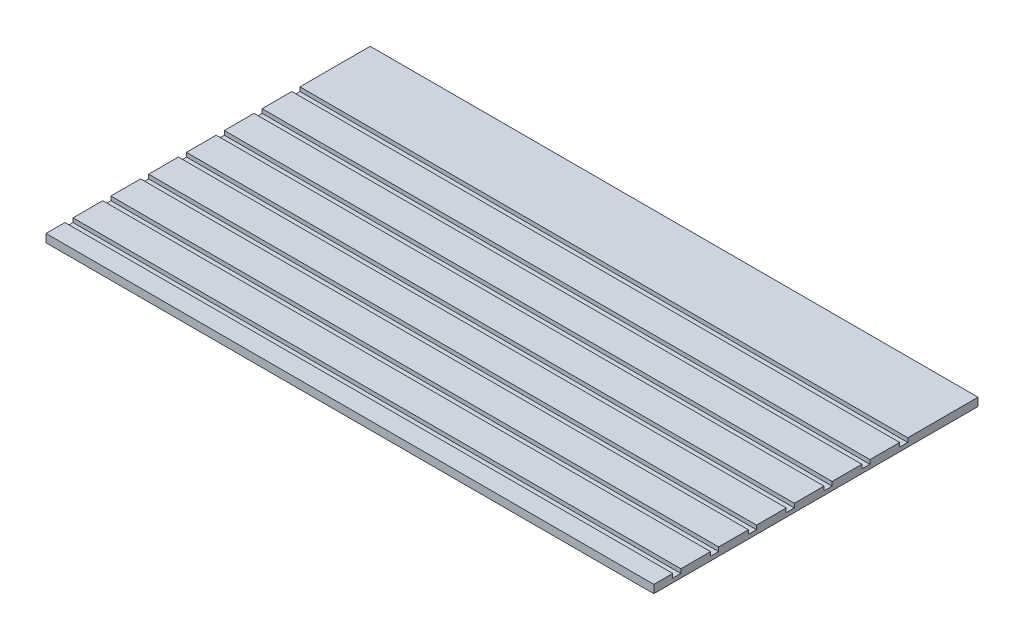
ISO-10303-21;
HEADER;
FILE_DESCRIPTION(('STEP AP214'),'2;1');
FILE_NAME('part.step','',(''),(''),'','','');
FILE_SCHEMA(('AUTOMOTIVE_DESIGN { 1 0 10303 214 1 1 1 1 }'));
ENDSEC;
DATA;
#1=APPLICATION_CONTEXT('core data for automotive mechanical design processes');
#2=APPLICATION_PROTOCOL_DEFINITION('international standard','automotive_design',2000,#1);
#3=PRODUCT_CONTEXT('',#1,'mechanical');
#4=PRODUCT('Part','Part','',(#3));
#5=PRODUCT_RELATED_PRODUCT_CATEGORY('part','',(#4));
#6=PRODUCT_DEFINITION_FORMATION('','',#4);
#7=PRODUCT_DEFINITION_CONTEXT('part definition',#1,'design');
#8=PRODUCT_DEFINITION('design','',#6,#7);
#9=PRODUCT_DEFINITION_SHAPE('','',#8);
#10=(LENGTH_UNIT() NAMED_UNIT(*) SI_UNIT(.MILLI.,.METRE.));
#11=(NAMED_UNIT(*) PLANE_ANGLE_UNIT() SI_UNIT($,.RADIAN.));
#12=(NAMED_UNIT(*) SI_UNIT($,.STERADIAN.) SOLID_ANGLE_UNIT());
#13=UNCERTAINTY_MEASURE_WITH_UNIT(LENGTH_MEASURE(1.E-05),#10,'distance_accuracy_value','');
#14=(GEOMETRIC_REPRESENTATION_CONTEXT(3) GLOBAL_UNCERTAINTY_ASSIGNED_CONTEXT((#13)) GLOBAL_UNIT_ASSIGNED_CONTEXT((#10,
#11,#12)) REPRESENTATION_CONTEXT('',''));
#15=CARTESIAN_POINT('',(0.,0.,0.));
#16=DIRECTION('',(0.,0.,1.));
#17=DIRECTION('',(1.,0.,0.));
#18=AXIS2_PLACEMENT_3D('',#15,#16,#17);
#19=CARTESIAN_POINT('',(0.,19.05,0.));
#20=DIRECTION('',(0.,-1.,0.));
#21=DIRECTION('',(0.,0.,-1.));
#22=AXIS2_PLACEMENT_3D('',#19,#20,#21);
#23=PLANE('',#22);
#24=DIRECTION('',(0.,0.,1.));
#25=VECTOR('',#24,1.);
#26=CARTESIAN_POINT('',(-714.375,19.05,381.));
#27=LINE('',#26,#25);
#28=CARTESIAN_POINT('',(-714.375,19.05,-381.));
#29=VERTEX_POINT('',#28);
#30=CARTESIAN_POINT('',(-714.375,19.05,-215.9));
#31=VERTEX_POINT('',#30);
#32=EDGE_CURVE('E441',#29,#31,#27,.T.);
#33=ORIENTED_EDGE('',*,*,#32,.T.);
#34=DIRECTION('',(-1.,0.,0.));
#35=VECTOR('',#34,1.);
#36=CARTESIAN_POINT('',(714.375,19.05,-215.9));
#37=LINE('',#36,#35);
#38=CARTESIAN_POINT('',(714.375,19.05,-215.9));
#39=VERTEX_POINT('',#38);
#40=EDGE_CURVE('E274',#39,#31,#37,.T.);
#41=ORIENTED_EDGE('',*,*,#40,.F.);
#42=DIRECTION('',(0.,0.,-1.));
#43=VECTOR('',#42,1.);
#44=CARTESIAN_POINT('',(714.375,19.05,381.));
#45=LINE('',#44,#43);
#46=CARTESIAN_POINT('',(714.375,19.05,-381.));
#47=VERTEX_POINT('',#46);
#48=EDGE_CURVE('E265',#39,#47,#45,.T.);
#49=ORIENTED_EDGE('',*,*,#48,.T.);
#50=DIRECTION('',(-1.,0.,0.));
#51=VECTOR('',#50,1.);
#52=CARTESIAN_POINT('',(-714.375,19.05,-381.));
#53=LINE('',#52,#51);
#54=EDGE_CURVE('E451',#47,#29,#53,.T.);
#55=ORIENTED_EDGE('',*,*,#54,.T.);
#56=EDGE_LOOP('',(#33,#41,#49,#55));
#57=FACE_BOUND('',#56,.T.);
#58=ADVANCED_FACE('F36',(#57),#23,.F.);
#59=CARTESIAN_POINT('',(714.375,19.05,-127.));
#60=VERTEX_POINT('',#59);
#61=CARTESIAN_POINT('',(714.375,19.05,-196.85));
#62=VERTEX_POINT('',#61);
#63=EDGE_CURVE('E485',#60,#62,#45,.T.);
#64=ORIENTED_EDGE('',*,*,#63,.T.);
#65=DIRECTION('',(-1.,0.,0.));
#66=VECTOR('',#65,1.);
#67=CARTESIAN_POINT('',(714.375,19.05,-196.85));
#68=LINE('',#67,#66);
#69=CARTESIAN_POINT('',(-714.375,19.05,-196.85));
#70=VERTEX_POINT('',#69);
#71=EDGE_CURVE('E277',#62,#70,#68,.T.);
#72=ORIENTED_EDGE('',*,*,#71,.T.);
#73=CARTESIAN_POINT('',(-714.375,19.05,-127.));
#74=VERTEX_POINT('',#73);
#75=EDGE_CURVE('E445',#70,#74,#27,.T.);
#76=ORIENTED_EDGE('',*,*,#75,.T.);
#77=DIRECTION('',(-1.,0.,0.));
#78=VECTOR('',#77,1.);
#79=CARTESIAN_POINT('',(714.375,19.05,-127.));
#80=LINE('',#79,#78);
#81=EDGE_CURVE('E296',#60,#74,#80,.T.);
#82=ORIENTED_EDGE('',*,*,#81,.F.);
#83=EDGE_LOOP('',(#64,#72,#76,#82));
#84=FACE_BOUND('',#83,.T.);
#85=ADVANCED_FACE('F542',(#84),#23,.F.);
#86=CARTESIAN_POINT('',(714.375,19.05,-38.1));
#87=VERTEX_POINT('',#86);
#88=CARTESIAN_POINT('',(714.375,19.05,-107.95));
#89=VERTEX_POINT('',#88);
#90=EDGE_CURVE('E487',#87,#89,#45,.T.);
#91=ORIENTED_EDGE('',*,*,#90,.T.);
#92=DIRECTION('',(-1.,0.,0.));
#93=VECTOR('',#92,1.);
#94=CARTESIAN_POINT('',(714.375,19.05,-107.95));
#95=LINE('',#94,#93);
#96=CARTESIAN_POINT('',(-714.375,19.05,-107.95));
#97=VERTEX_POINT('',#96);
#98=EDGE_CURVE('E300',#89,#97,#95,.T.);
#99=ORIENTED_EDGE('',*,*,#98,.T.);
#100=CARTESIAN_POINT('',(-714.375,19.05,-38.1));
#101=VERTEX_POINT('',#100);
#102=EDGE_CURVE('E841',#97,#101,#27,.T.);
#103=ORIENTED_EDGE('',*,*,#102,.T.);
#104=DIRECTION('',(-1.,0.,0.));
#105=VECTOR('',#104,1.);
#106=CARTESIAN_POINT('',(714.375,19.05,-38.1));
#107=LINE('',#106,#105);
#108=EDGE_CURVE('E323',#87,#101,#107,.T.);
#109=ORIENTED_EDGE('',*,*,#108,.F.);
#110=EDGE_LOOP('',(#91,#99,#103,#109));
#111=FACE_BOUND('',#110,.T.);
#112=ADVANCED_FACE('F547',(#111),#23,.F.);
#113=CARTESIAN_POINT('',(714.375,19.05,50.8));
#114=VERTEX_POINT('',#113);
#115=CARTESIAN_POINT('',(714.375,19.05,-19.05));
#116=VERTEX_POINT('',#115);
#117=EDGE_CURVE('E492',#114,#116,#45,.T.);
#118=ORIENTED_EDGE('',*,*,#117,.T.);
#119=DIRECTION('',(-1.,0.,0.));
#120=VECTOR('',#119,1.);
#121=CARTESIAN_POINT('',(714.375,19.05,-19.05));
#122=LINE('',#121,#120);
#123=CARTESIAN_POINT('',(-714.375,19.05,-19.05));
#124=VERTEX_POINT('',#123);
#125=EDGE_CURVE('E327',#116,#124,#122,.T.);
#126=ORIENTED_EDGE('',*,*,#125,.T.);
#127=CARTESIAN_POINT('',(-714.375,19.05,50.8));
#128=VERTEX_POINT('',#127);
#129=EDGE_CURVE('E842',#124,#128,#27,.T.);
#130=ORIENTED_EDGE('',*,*,#129,.T.);
#131=DIRECTION('',(-1.,0.,0.));
#132=VECTOR('',#131,1.);
#133=CARTESIAN_POINT('',(714.375,19.05,50.8));
#134=LINE('',#133,#132);
#135=EDGE_CURVE('E350',#114,#128,#134,.T.);
#136=ORIENTED_EDGE('',*,*,#135,.F.);
#137=EDGE_LOOP('',(#118,#126,#130,#136));
#138=FACE_BOUND('',#137,.T.);
#139=ADVANCED_FACE('F566',(#138),#23,.F.);
#140=CARTESIAN_POINT('',(714.375,19.05,139.7));
#141=VERTEX_POINT('',#140);
#142=CARTESIAN_POINT('',(714.375,19.05,69.85));
#143=VERTEX_POINT('',#142);
#144=EDGE_CURVE('E497',#141,#143,#45,.T.);
#145=ORIENTED_EDGE('',*,*,#144,.T.);
#146=DIRECTION('',(-1.,0.,0.));
#147=VECTOR('',#146,1.);
#148=CARTESIAN_POINT('',(714.375,19.05,69.85));
#149=LINE('',#148,#147);
#150=CARTESIAN_POINT('',(-714.375,19.05,69.85));
#151=VERTEX_POINT('',#150);
#152=EDGE_CURVE('E354',#143,#151,#149,.T.);
#153=ORIENTED_EDGE('',*,*,#152,.T.);
#154=CARTESIAN_POINT('',(-714.375,19.05,139.7));
#155=VERTEX_POINT('',#154);
#156=EDGE_CURVE('E529',#151,#155,#27,.T.);
#157=ORIENTED_EDGE('',*,*,#156,.T.);
#158=DIRECTION('',(-1.,0.,0.));
#159=VECTOR('',#158,1.);
#160=CARTESIAN_POINT('',(714.375,19.05,139.7));
#161=LINE('',#160,#159);
#162=EDGE_CURVE('E377',#141,#155,#161,.T.);
#163=ORIENTED_EDGE('',*,*,#162,.F.);
#164=EDGE_LOOP('',(#145,#153,#157,#163));
#165=FACE_BOUND('',#164,.T.);
#166=ADVANCED_FACE('F562',(#165),#23,.F.);
#167=CARTESIAN_POINT('',(714.375,19.05,228.6));
#168=VERTEX_POINT('',#167);
#169=CARTESIAN_POINT('',(714.375,19.05,158.75));
#170=VERTEX_POINT('',#169);
#171=EDGE_CURVE('E502',#168,#170,#45,.T.);
#172=ORIENTED_EDGE('',*,*,#171,.T.);
#173=DIRECTION('',(-1.,0.,0.));
#174=VECTOR('',#173,1.);
#175=CARTESIAN_POINT('',(714.375,19.05,158.75));
#176=LINE('',#175,#174);
#177=CARTESIAN_POINT('',(-714.375,19.05,158.75));
#178=VERTEX_POINT('',#177);
#179=EDGE_CURVE('E381',#170,#178,#176,.T.);
#180=ORIENTED_EDGE('',*,*,#179,.T.);
#181=CARTESIAN_POINT('',(-714.375,19.05,228.6));
#182=VERTEX_POINT('',#181);
#183=EDGE_CURVE('E528',#178,#182,#27,.T.);
#184=ORIENTED_EDGE('',*,*,#183,.T.);
#185=DIRECTION('',(-1.,0.,0.));
#186=VECTOR('',#185,1.);
#187=CARTESIAN_POINT('',(714.375,19.05,228.6));
#188=LINE('',#187,#186);
#189=EDGE_CURVE('E404',#168,#182,#188,.T.);
#190=ORIENTED_EDGE('',*,*,#189,.F.);
#191=EDGE_LOOP('',(#172,#180,#184,#190));
#192=FACE_BOUND('',#191,.T.);
#193=ADVANCED_FACE('F558',(#192),#23,.F.);
#194=CARTESIAN_POINT('',(714.375,19.05,317.5));
#195=VERTEX_POINT('',#194);
#196=CARTESIAN_POINT('',(714.375,19.05,247.65));
#197=VERTEX_POINT('',#196);
#198=EDGE_CURVE('E452',#195,#197,#45,.T.);
#199=ORIENTED_EDGE('',*,*,#198,.T.);
#200=DIRECTION('',(-1.,0.,0.));
#201=VECTOR('',#200,1.);
#202=CARTESIAN_POINT('',(714.375,19.05,247.65));
#203=LINE('',#202,#201);
#204=CARTESIAN_POINT('',(-714.375,19.05,247.65));
#205=VERTEX_POINT('',#204);
#206=EDGE_CURVE('E408',#197,#205,#203,.T.);
#207=ORIENTED_EDGE('',*,*,#206,.T.);
#208=CARTESIAN_POINT('',(-714.375,19.05,317.5));
#209=VERTEX_POINT('',#208);
#210=EDGE_CURVE('E526',#205,#209,#27,.T.);
#211=ORIENTED_EDGE('',*,*,#210,.T.);
#212=DIRECTION('',(-1.,0.,0.));
#213=VECTOR('',#212,1.);
#214=CARTESIAN_POINT('',(714.375,19.05,317.5));
#215=LINE('',#214,#213);
#216=EDGE_CURVE('E431',#195,#209,#215,.T.);
#217=ORIENTED_EDGE('',*,*,#216,.F.);
#218=EDGE_LOOP('',(#199,#207,#211,#217));
#219=FACE_BOUND('',#218,.T.);
#220=ADVANCED_FACE('F514',(#219),#23,.F.);
#221=CARTESIAN_POINT('',(-714.375,19.05,381.));
#222=DIRECTION('',(1.,0.,0.));
#223=DIRECTION('',(0.,0.,-1.));
#224=AXIS2_PLACEMENT_3D('',#221,#222,#223);
#225=PLANE('',#224);
#226=DIRECTION('',(0.,0.,1.));
#227=VECTOR('',#226,1.);
#228=CARTESIAN_POINT('',(-714.375,9.52500000000001,-215.9));
#229=LINE('',#228,#227);
#230=CARTESIAN_POINT('',(-714.375,9.52500000000001,-215.9));
#231=VERTEX_POINT('',#230);
#232=CARTESIAN_POINT('',(-714.375,9.52500000000001,-196.85));
#233=VERTEX_POINT('',#232);
#234=EDGE_CURVE('E268',#231,#233,#229,.T.);
#235=ORIENTED_EDGE('',*,*,#234,.F.);
#236=DIRECTION('',(0.,-1.,0.));
#237=VECTOR('',#236,1.);
#238=CARTESIAN_POINT('',(-714.375,19.05,-215.9));
#239=LINE('',#238,#237);
#240=EDGE_CURVE('E251',#31,#231,#239,.T.);
#241=ORIENTED_EDGE('',*,*,#240,.F.);
#242=ORIENTED_EDGE('',*,*,#32,.F.);
#243=DIRECTION('',(0.,-1.,0.));
#244=VECTOR('',#243,1.);
#245=CARTESIAN_POINT('',(-714.375,19.05,-381.));
#246=LINE('',#245,#244);
#247=CARTESIAN_POINT('',(-714.375,0.,-381.));
#248=VERTEX_POINT('',#247);
#249=EDGE_CURVE('E454',#29,#248,#246,.T.);
#250=ORIENTED_EDGE('',*,*,#249,.T.);
#251=DIRECTION('',(0.,0.,1.));
#252=VECTOR('',#251,1.);
#253=CARTESIAN_POINT('',(-714.375,0.,381.));
#254=LINE('',#253,#252);
#255=CARTESIAN_POINT('',(-714.375,0.,381.));
#256=VERTEX_POINT('',#255);
#257=EDGE_CURVE('E434',#248,#256,#254,.T.);
#258=ORIENTED_EDGE('',*,*,#257,.T.);
#259=DIRECTION('',(0.,-1.,0.));
#260=VECTOR('',#259,1.);
#261=CARTESIAN_POINT('',(-714.375,19.05,381.));
#262=LINE('',#261,#260);
#263=CARTESIAN_POINT('',(-714.375,19.05,381.));
#264=VERTEX_POINT('',#263);
#265=EDGE_CURVE('E11',#264,#256,#262,.T.);
#266=ORIENTED_EDGE('',*,*,#265,.F.);
#267=CARTESIAN_POINT('',(-714.375,19.05,336.55));
#268=VERTEX_POINT('',#267);
#269=EDGE_CURVE('E446',#268,#264,#27,.T.);
#270=ORIENTED_EDGE('',*,*,#269,.F.);
#271=DIRECTION('',(0.,1.,0.));
#272=VECTOR('',#271,1.);
#273=CARTESIAN_POINT('',(-714.375,19.05,336.55));
#274=LINE('',#273,#272);
#275=CARTESIAN_POINT('',(-714.375,9.52500000000001,336.55));
#276=VERTEX_POINT('',#275);
#277=EDGE_CURVE('E418',#276,#268,#274,.T.);
#278=ORIENTED_EDGE('',*,*,#277,.F.);
#279=DIRECTION('',(0.,0.,1.));
#280=VECTOR('',#279,1.);
#281=CARTESIAN_POINT('',(-714.375,9.52500000000001,317.5));
#282=LINE('',#281,#280);
#283=CARTESIAN_POINT('',(-714.375,9.52500000000001,317.5));
#284=VERTEX_POINT('',#283);
#285=EDGE_CURVE('E427',#284,#276,#282,.T.);
#286=ORIENTED_EDGE('',*,*,#285,.F.);
#287=DIRECTION('',(0.,-1.,0.));
#288=VECTOR('',#287,1.);
#289=CARTESIAN_POINT('',(-714.375,19.05,317.5));
#290=LINE('',#289,#288);
#291=EDGE_CURVE('E407',#209,#284,#290,.T.);
#292=ORIENTED_EDGE('',*,*,#291,.F.);
#293=ORIENTED_EDGE('',*,*,#210,.F.);
#294=DIRECTION('',(0.,1.,0.));
#295=VECTOR('',#294,1.);
#296=CARTESIAN_POINT('',(-714.375,19.05,247.65));
#297=LINE('',#296,#295);
#298=CARTESIAN_POINT('',(-714.375,9.52500000000001,247.65));
#299=VERTEX_POINT('',#298);
#300=EDGE_CURVE('E391',#299,#205,#297,.T.);
#301=ORIENTED_EDGE('',*,*,#300,.F.);
#302=DIRECTION('',(0.,0.,1.));
#303=VECTOR('',#302,1.);
#304=CARTESIAN_POINT('',(-714.375,9.52500000000001,228.6));
#305=LINE('',#304,#303);
#306=CARTESIAN_POINT('',(-714.375,9.52500000000001,228.6));
#307=VERTEX_POINT('',#306);
#308=EDGE_CURVE('E400',#307,#299,#305,.T.);
#309=ORIENTED_EDGE('',*,*,#308,.F.);
#310=DIRECTION('',(0.,-1.,0.));
#311=VECTOR('',#310,1.);
#312=CARTESIAN_POINT('',(-714.375,19.05,228.6));
#313=LINE('',#312,#311);
#314=EDGE_CURVE('E380',#182,#307,#313,.T.);
#315=ORIENTED_EDGE('',*,*,#314,.F.);
#316=ORIENTED_EDGE('',*,*,#183,.F.);
#317=DIRECTION('',(0.,1.,0.));
#318=VECTOR('',#317,1.);
#319=CARTESIAN_POINT('',(-714.375,19.05,158.75));
#320=LINE('',#319,#318);
#321=CARTESIAN_POINT('',(-714.375,9.52500000000001,158.75));
#322=VERTEX_POINT('',#321);
#323=EDGE_CURVE('E364',#322,#178,#320,.T.);
#324=ORIENTED_EDGE('',*,*,#323,.F.);
#325=DIRECTION('',(0.,0.,1.));
#326=VECTOR('',#325,1.);
#327=CARTESIAN_POINT('',(-714.375,9.52500000000001,139.7));
#328=LINE('',#327,#326);
#329=CARTESIAN_POINT('',(-714.375,9.52500000000001,139.7));
#330=VERTEX_POINT('',#329);
#331=EDGE_CURVE('E373',#330,#322,#328,.T.);
#332=ORIENTED_EDGE('',*,*,#331,.F.);
#333=DIRECTION('',(0.,-1.,0.));
#334=VECTOR('',#333,1.);
#335=CARTESIAN_POINT('',(-714.375,19.05,139.7));
#336=LINE('',#335,#334);
#337=EDGE_CURVE('E353',#155,#330,#336,.T.);
#338=ORIENTED_EDGE('',*,*,#337,.F.);
#339=ORIENTED_EDGE('',*,*,#156,.F.);
#340=DIRECTION('',(0.,1.,0.));
#341=VECTOR('',#340,1.);
#342=CARTESIAN_POINT('',(-714.375,19.05,69.85));
#343=LINE('',#342,#341);
#344=CARTESIAN_POINT('',(-714.375,9.52500000000001,69.85));
#345=VERTEX_POINT('',#344);
#346=EDGE_CURVE('E337',#345,#151,#343,.T.);
#347=ORIENTED_EDGE('',*,*,#346,.F.);
#348=DIRECTION('',(0.,0.,1.));
#349=VECTOR('',#348,1.);
#350=CARTESIAN_POINT('',(-714.375,9.52500000000001,50.8));
#351=LINE('',#350,#349);
#352=CARTESIAN_POINT('',(-714.375,9.52500000000001,50.8));
#353=VERTEX_POINT('',#352);
#354=EDGE_CURVE('E346',#353,#345,#351,.T.);
#355=ORIENTED_EDGE('',*,*,#354,.F.);
#356=DIRECTION('',(0.,-1.,0.));
#357=VECTOR('',#356,1.);
#358=CARTESIAN_POINT('',(-714.375,19.05,50.8));
#359=LINE('',#358,#357);
#360=EDGE_CURVE('E326',#128,#353,#359,.T.);
#361=ORIENTED_EDGE('',*,*,#360,.F.);
#362=ORIENTED_EDGE('',*,*,#129,.F.);
#363=DIRECTION('',(0.,1.,0.));
#364=VECTOR('',#363,1.);
#365=CARTESIAN_POINT('',(-714.375,19.05,-19.05));
#366=LINE('',#365,#364);
#367=CARTESIAN_POINT('',(-714.375,9.52500000000001,-19.05));
#368=VERTEX_POINT('',#367);
#369=EDGE_CURVE('E310',#368,#124,#366,.T.);
#370=ORIENTED_EDGE('',*,*,#369,.F.);
#371=DIRECTION('',(0.,0.,1.));
#372=VECTOR('',#371,1.);
#373=CARTESIAN_POINT('',(-714.375,9.52500000000001,-38.1));
#374=LINE('',#373,#372);
#375=CARTESIAN_POINT('',(-714.375,9.52500000000001,-38.1));
#376=VERTEX_POINT('',#375);
#377=EDGE_CURVE('E319',#376,#368,#374,.T.);
#378=ORIENTED_EDGE('',*,*,#377,.F.);
#379=DIRECTION('',(0.,-1.,0.));
#380=VECTOR('',#379,1.);
#381=CARTESIAN_POINT('',(-714.375,19.05,-38.1));
#382=LINE('',#381,#380);
#383=EDGE_CURVE('E299',#101,#376,#382,.T.);
#384=ORIENTED_EDGE('',*,*,#383,.F.);
#385=ORIENTED_EDGE('',*,*,#102,.F.);
#386=DIRECTION('',(0.,1.,0.));
#387=VECTOR('',#386,1.);
#388=CARTESIAN_POINT('',(-714.375,19.05,-107.95));
#389=LINE('',#388,#387);
#390=CARTESIAN_POINT('',(-714.375,9.52500000000001,-107.95));
#391=VERTEX_POINT('',#390);
#392=EDGE_CURVE('E285',#391,#97,#389,.T.);
#393=ORIENTED_EDGE('',*,*,#392,.F.);
#394=DIRECTION('',(0.,0.,1.));
#395=VECTOR('',#394,1.);
#396=CARTESIAN_POINT('',(-714.375,9.52500000000001,-127.));
#397=LINE('',#396,#395);
#398=CARTESIAN_POINT('',(-714.375,9.52500000000001,-127.));
#399=VERTEX_POINT('',#398);
#400=EDGE_CURVE('E292',#399,#391,#397,.T.);
#401=ORIENTED_EDGE('',*,*,#400,.F.);
#402=DIRECTION('',(0.,-1.,0.));
#403=VECTOR('',#402,1.);
#404=CARTESIAN_POINT('',(-714.375,19.05,-127.));
#405=LINE('',#404,#403);
#406=EDGE_CURVE('E276',#74,#399,#405,.T.);
#407=ORIENTED_EDGE('',*,*,#406,.F.);
#408=ORIENTED_EDGE('',*,*,#75,.F.);
#409=DIRECTION('',(0.,1.,0.));
#410=VECTOR('',#409,1.);
#411=CARTESIAN_POINT('',(-714.375,19.05,-196.85));
#412=LINE('',#411,#410);
#413=EDGE_CURVE('E266',#233,#70,#412,.T.);
#414=ORIENTED_EDGE('',*,*,#413,.F.);
#415=EDGE_LOOP('',(#235,#241,#242,#250,#258,#266,#270,#278,#286,#292,#293,#301,#309,#315,#316,
#324,#332,#338,#339,#347,#355,#361,#362,#370,#378,#384,#385,#393,#401,#407,#408,#414));
#416=FACE_BOUND('',#415,.T.);
#417=ADVANCED_FACE('F38',(#416),#225,.F.);
#418=CARTESIAN_POINT('',(-714.375,19.05,381.));
#419=DIRECTION('',(0.,0.,-1.));
#420=DIRECTION('',(-1.,0.,0.));
#421=AXIS2_PLACEMENT_3D('',#418,#419,#420);
#422=PLANE('',#421);
#423=DIRECTION('',(1.,0.,0.));
#424=VECTOR('',#423,1.);
#425=CARTESIAN_POINT('',(-714.375,0.,381.));
#426=LINE('',#425,#424);
#427=CARTESIAN_POINT('',(714.375,0.,381.));
#428=VERTEX_POINT('',#427);
#429=EDGE_CURVE('E457',#256,#428,#426,.T.);
#430=ORIENTED_EDGE('',*,*,#429,.T.);
#431=DIRECTION('',(0.,-1.,0.));
#432=VECTOR('',#431,1.);
#433=CARTESIAN_POINT('',(714.375,19.05,381.));
#434=LINE('',#433,#432);
#435=CARTESIAN_POINT('',(714.375,19.05,381.));
#436=VERTEX_POINT('',#435);
#437=EDGE_CURVE('E44',#436,#428,#434,.T.);
#438=ORIENTED_EDGE('',*,*,#437,.F.);
#439=DIRECTION('',(1.,0.,0.));
#440=VECTOR('',#439,1.);
#441=CARTESIAN_POINT('',(-714.375,19.05,381.));
#442=LINE('',#441,#440);
#443=EDGE_CURVE('E444',#264,#436,#442,.T.);
#444=ORIENTED_EDGE('',*,*,#443,.F.);
#445=ORIENTED_EDGE('',*,*,#265,.T.);
#446=EDGE_LOOP('',(#430,#438,#444,#445));
#447=FACE_BOUND('',#446,.T.);
#448=ADVANCED_FACE('F534',(#447),#422,.F.);
#449=CARTESIAN_POINT('',(714.375,19.05,381.));
#450=DIRECTION('',(-1.,0.,0.));
#451=DIRECTION('',(0.,0.,1.));
#452=AXIS2_PLACEMENT_3D('',#449,#450,#451);
#453=PLANE('',#452);
#454=ORIENTED_EDGE('',*,*,#48,.F.);
#455=DIRECTION('',(0.,-1.,0.));
#456=VECTOR('',#455,1.);
#457=CARTESIAN_POINT('',(714.375,19.05,-215.9));
#458=LINE('',#457,#456);
#459=CARTESIAN_POINT('',(714.375,9.52500000000001,-215.9));
#460=VERTEX_POINT('',#459);
#461=EDGE_CURVE('E248',#39,#460,#458,.T.);
#462=ORIENTED_EDGE('',*,*,#461,.T.);
#463=DIRECTION('',(0.,0.,1.));
#464=VECTOR('',#463,1.);
#465=CARTESIAN_POINT('',(714.375,9.52500000000001,-215.9));
#466=LINE('',#465,#464);
#467=CARTESIAN_POINT('',(714.375,9.52500000000001,-196.85));
#468=VERTEX_POINT('',#467);
#469=EDGE_CURVE('E258',#460,#468,#466,.T.);
#470=ORIENTED_EDGE('',*,*,#469,.T.);
#471=DIRECTION('',(0.,1.,0.));
#472=VECTOR('',#471,1.);
#473=CARTESIAN_POINT('',(714.375,19.05,-196.85));
#474=LINE('',#473,#472);
#475=EDGE_CURVE('E51',#468,#62,#474,.T.);
#476=ORIENTED_EDGE('',*,*,#475,.T.);
#477=ORIENTED_EDGE('',*,*,#63,.F.);
#478=DIRECTION('',(0.,-1.,0.));
#479=VECTOR('',#478,1.);
#480=CARTESIAN_POINT('',(714.375,19.05,-127.));
#481=LINE('',#480,#479);
#482=CARTESIAN_POINT('',(714.375,9.52500000000001,-127.));
#483=VERTEX_POINT('',#482);
#484=EDGE_CURVE('E281',#60,#483,#481,.T.);
#485=ORIENTED_EDGE('',*,*,#484,.T.);
#486=DIRECTION('',(0.,0.,1.));
#487=VECTOR('',#486,1.);
#488=CARTESIAN_POINT('',(714.375,9.52500000000001,-127.));
#489=LINE('',#488,#487);
#490=CARTESIAN_POINT('',(714.375,9.52500000000001,-107.95));
#491=VERTEX_POINT('',#490);
#492=EDGE_CURVE('E284',#483,#491,#489,.T.);
#493=ORIENTED_EDGE('',*,*,#492,.T.);
#494=DIRECTION('',(0.,1.,0.));
#495=VECTOR('',#494,1.);
#496=CARTESIAN_POINT('',(714.375,19.05,-107.95));
#497=LINE('',#496,#495);
#498=EDGE_CURVE('E59',#491,#89,#497,.T.);
#499=ORIENTED_EDGE('',*,*,#498,.T.);
#500=ORIENTED_EDGE('',*,*,#90,.F.);
#501=DIRECTION('',(0.,-1.,0.));
#502=VECTOR('',#501,1.);
#503=CARTESIAN_POINT('',(714.375,19.05,-38.1));
#504=LINE('',#503,#502);
#505=CARTESIAN_POINT('',(714.375,9.52500000000001,-38.1));
#506=VERTEX_POINT('',#505);
#507=EDGE_CURVE('E306',#87,#506,#504,.T.);
#508=ORIENTED_EDGE('',*,*,#507,.T.);
#509=DIRECTION('',(0.,0.,1.));
#510=VECTOR('',#509,1.);
#511=CARTESIAN_POINT('',(714.375,9.52500000000001,-38.1));
#512=LINE('',#511,#510);
#513=CARTESIAN_POINT('',(714.375,9.52500000000001,-19.05));
#514=VERTEX_POINT('',#513);
#515=EDGE_CURVE('E309',#506,#514,#512,.T.);
#516=ORIENTED_EDGE('',*,*,#515,.T.);
#517=DIRECTION('',(0.,1.,0.));
#518=VECTOR('',#517,1.);
#519=CARTESIAN_POINT('',(714.375,19.05,-19.05));
#520=LINE('',#519,#518);
#521=EDGE_CURVE('E313',#514,#116,#520,.T.);
#522=ORIENTED_EDGE('',*,*,#521,.T.);
#523=ORIENTED_EDGE('',*,*,#117,.F.);
#524=DIRECTION('',(0.,-1.,0.));
#525=VECTOR('',#524,1.);
#526=CARTESIAN_POINT('',(714.375,19.05,50.8));
#527=LINE('',#526,#525);
#528=CARTESIAN_POINT('',(714.375,9.52500000000001,50.8));
#529=VERTEX_POINT('',#528);
#530=EDGE_CURVE('E333',#114,#529,#527,.T.);
#531=ORIENTED_EDGE('',*,*,#530,.T.);
#532=DIRECTION('',(0.,0.,1.));
#533=VECTOR('',#532,1.);
#534=CARTESIAN_POINT('',(714.375,9.52500000000001,50.8));
#535=LINE('',#534,#533);
#536=CARTESIAN_POINT('',(714.375,9.52500000000001,69.85));
#537=VERTEX_POINT('',#536);
#538=EDGE_CURVE('E336',#529,#537,#535,.T.);
#539=ORIENTED_EDGE('',*,*,#538,.T.);
#540=DIRECTION('',(0.,1.,0.));
#541=VECTOR('',#540,1.);
#542=CARTESIAN_POINT('',(714.375,19.05,69.85));
#543=LINE('',#542,#541);
#544=EDGE_CURVE('E340',#537,#143,#543,.T.);
#545=ORIENTED_EDGE('',*,*,#544,.T.);
#546=ORIENTED_EDGE('',*,*,#144,.F.);
#547=DIRECTION('',(0.,-1.,0.));
#548=VECTOR('',#547,1.);
#549=CARTESIAN_POINT('',(714.375,19.05,139.7));
#550=LINE('',#549,#548);
#551=CARTESIAN_POINT('',(714.375,9.52500000000001,139.7));
#552=VERTEX_POINT('',#551);
#553=EDGE_CURVE('E360',#141,#552,#550,.T.);
#554=ORIENTED_EDGE('',*,*,#553,.T.);
#555=DIRECTION('',(0.,0.,1.));
#556=VECTOR('',#555,1.);
#557=CARTESIAN_POINT('',(714.375,9.52500000000001,139.7));
#558=LINE('',#557,#556);
#559=CARTESIAN_POINT('',(714.375,9.52500000000001,158.75));
#560=VERTEX_POINT('',#559);
#561=EDGE_CURVE('E363',#552,#560,#558,.T.);
#562=ORIENTED_EDGE('',*,*,#561,.T.);
#563=DIRECTION('',(0.,1.,0.));
#564=VECTOR('',#563,1.);
#565=CARTESIAN_POINT('',(714.375,19.05,158.75));
#566=LINE('',#565,#564);
#567=EDGE_CURVE('E367',#560,#170,#566,.T.);
#568=ORIENTED_EDGE('',*,*,#567,.T.);
#569=ORIENTED_EDGE('',*,*,#171,.F.);
#570=DIRECTION('',(0.,-1.,0.));
#571=VECTOR('',#570,1.);
#572=CARTESIAN_POINT('',(714.375,19.05,228.6));
#573=LINE('',#572,#571);
#574=CARTESIAN_POINT('',(714.375,9.52500000000001,228.6));
#575=VERTEX_POINT('',#574);
#576=EDGE_CURVE('E387',#168,#575,#573,.T.);
#577=ORIENTED_EDGE('',*,*,#576,.T.);
#578=DIRECTION('',(0.,0.,1.));
#579=VECTOR('',#578,1.);
#580=CARTESIAN_POINT('',(714.375,9.52500000000001,228.6));
#581=LINE('',#580,#579);
#582=CARTESIAN_POINT('',(714.375,9.52500000000001,247.65));
#583=VERTEX_POINT('',#582);
#584=EDGE_CURVE('E390',#575,#583,#581,.T.);
#585=ORIENTED_EDGE('',*,*,#584,.T.);
#586=DIRECTION('',(0.,1.,0.));
#587=VECTOR('',#586,1.);
#588=CARTESIAN_POINT('',(714.375,19.05,247.65));
#589=LINE('',#588,#587);
#590=EDGE_CURVE('E394',#583,#197,#589,.T.);
#591=ORIENTED_EDGE('',*,*,#590,.T.);
#592=ORIENTED_EDGE('',*,*,#198,.F.);
#593=DIRECTION('',(0.,-1.,0.));
#594=VECTOR('',#593,1.);
#595=CARTESIAN_POINT('',(714.375,19.05,317.5));
#596=LINE('',#595,#594);
#597=CARTESIAN_POINT('',(714.375,9.52500000000001,317.5));
#598=VERTEX_POINT('',#597);
#599=EDGE_CURVE('E414',#195,#598,#596,.T.);
#600=ORIENTED_EDGE('',*,*,#599,.T.);
#601=DIRECTION('',(0.,0.,1.));
#602=VECTOR('',#601,1.);
#603=CARTESIAN_POINT('',(714.375,9.52500000000001,317.5));
#604=LINE('',#603,#602);
#605=CARTESIAN_POINT('',(714.375,9.52500000000001,336.55));
#606=VERTEX_POINT('',#605);
#607=EDGE_CURVE('E417',#598,#606,#604,.T.);
#608=ORIENTED_EDGE('',*,*,#607,.T.);
#609=DIRECTION('',(0.,1.,0.));
#610=VECTOR('',#609,1.);
#611=CARTESIAN_POINT('',(714.375,19.05,336.55));
#612=LINE('',#611,#610);
#613=CARTESIAN_POINT('',(714.375,19.05,336.55));
#614=VERTEX_POINT('',#613);
#615=EDGE_CURVE('E421',#606,#614,#612,.T.);
#616=ORIENTED_EDGE('',*,*,#615,.T.);
#617=EDGE_CURVE('E448',#436,#614,#45,.T.);
#618=ORIENTED_EDGE('',*,*,#617,.F.);
#619=ORIENTED_EDGE('',*,*,#437,.T.);
#620=DIRECTION('',(0.,0.,-1.));
#621=VECTOR('',#620,1.);
#622=CARTESIAN_POINT('',(714.375,0.,381.));
#623=LINE('',#622,#621);
#624=CARTESIAN_POINT('',(714.375,0.,-381.));
#625=VERTEX_POINT('',#624);
#626=EDGE_CURVE('E459',#428,#625,#623,.T.);
#627=ORIENTED_EDGE('',*,*,#626,.T.);
#628=DIRECTION('',(0.,-1.,0.));
#629=VECTOR('',#628,1.);
#630=CARTESIAN_POINT('',(714.375,19.05,-381.));
#631=LINE('',#630,#629);
#632=EDGE_CURVE('E465',#47,#625,#631,.T.);
#633=ORIENTED_EDGE('',*,*,#632,.F.);
#634=EDGE_LOOP('',(#454,#462,#470,#476,#477,#485,#493,#499,#500,#508,#516,#522,#523,#531,#539,
#545,#546,#554,#562,#568,#569,#577,#585,#591,#592,#600,#608,#616,#618,#619,#627,#633));
#635=FACE_BOUND('',#634,.T.);
#636=ADVANCED_FACE('F263',(#635),#453,.F.);
#637=CARTESIAN_POINT('',(-714.375,19.05,-381.));
#638=DIRECTION('',(0.,0.,1.));
#639=DIRECTION('',(1.,0.,0.));
#640=AXIS2_PLACEMENT_3D('',#637,#638,#639);
#641=PLANE('',#640);
#642=DIRECTION('',(-1.,0.,0.));
#643=VECTOR('',#642,1.);
#644=CARTESIAN_POINT('',(-714.375,0.,-381.));
#645=LINE('',#644,#643);
#646=EDGE_CURVE('E461',#625,#248,#645,.T.);
#647=ORIENTED_EDGE('',*,*,#646,.T.);
#648=ORIENTED_EDGE('',*,*,#249,.F.);
#649=ORIENTED_EDGE('',*,*,#54,.F.);
#650=ORIENTED_EDGE('',*,*,#632,.T.);
#651=EDGE_LOOP('',(#647,#648,#649,#650));
#652=FACE_BOUND('',#651,.T.);
#653=ADVANCED_FACE('F479',(#652),#641,.F.);
#654=ORIENTED_EDGE('',*,*,#617,.T.);
#655=DIRECTION('',(-1.,0.,0.));
#656=VECTOR('',#655,1.);
#657=CARTESIAN_POINT('',(714.375,19.05,336.55));
#658=LINE('',#657,#656);
#659=EDGE_CURVE('E435',#614,#268,#658,.T.);
#660=ORIENTED_EDGE('',*,*,#659,.T.);
#661=ORIENTED_EDGE('',*,*,#269,.T.);
#662=ORIENTED_EDGE('',*,*,#443,.T.);
#663=EDGE_LOOP('',(#654,#660,#661,#662));
#664=FACE_BOUND('',#663,.T.);
#665=ADVANCED_FACE('F532',(#664),#23,.F.);
#666=CARTESIAN_POINT('',(0.,0.,0.));
#667=DIRECTION('',(0.,-1.,0.));
#668=DIRECTION('',(0.,0.,-1.));
#669=AXIS2_PLACEMENT_3D('',#666,#667,#668);
#670=PLANE('',#669);
#671=ORIENTED_EDGE('',*,*,#257,.F.);
#672=ORIENTED_EDGE('',*,*,#646,.F.);
#673=ORIENTED_EDGE('',*,*,#626,.F.);
#674=ORIENTED_EDGE('',*,*,#429,.F.);
#675=EDGE_LOOP('',(#671,#672,#673,#674));
#676=FACE_BOUND('',#675,.T.);
#677=ADVANCED_FACE('F476',(#676),#670,.T.);
#678=CARTESIAN_POINT('',(714.375,19.05,317.5));
#679=DIRECTION('',(0.,0.,-1.));
#680=DIRECTION('',(-1.,0.,0.));
#681=AXIS2_PLACEMENT_3D('',#678,#679,#680);
#682=PLANE('',#681);
#683=ORIENTED_EDGE('',*,*,#291,.T.);
#684=DIRECTION('',(-1.,0.,0.));
#685=VECTOR('',#684,1.);
#686=CARTESIAN_POINT('',(714.375,9.52500000000001,317.5));
#687=LINE('',#686,#685);
#688=EDGE_CURVE('E424',#598,#284,#687,.T.);
#689=ORIENTED_EDGE('',*,*,#688,.F.);
#690=ORIENTED_EDGE('',*,*,#599,.F.);
#691=ORIENTED_EDGE('',*,*,#216,.T.);
#692=EDGE_LOOP('',(#683,#689,#690,#691));
#693=FACE_BOUND('',#692,.T.);
#694=ADVANCED_FACE('F555',(#693),#682,.F.);
#695=CARTESIAN_POINT('',(714.375,19.05,336.55));
#696=DIRECTION('',(0.,0.,1.));
#697=DIRECTION('',(1.,0.,0.));
#698=AXIS2_PLACEMENT_3D('',#695,#696,#697);
#699=PLANE('',#698);
#700=ORIENTED_EDGE('',*,*,#277,.T.);
#701=ORIENTED_EDGE('',*,*,#659,.F.);
#702=ORIENTED_EDGE('',*,*,#615,.F.);
#703=DIRECTION('',(-1.,0.,0.));
#704=VECTOR('',#703,1.);
#705=CARTESIAN_POINT('',(714.375,9.52500000000001,336.55));
#706=LINE('',#705,#704);
#707=EDGE_CURVE('E438',#606,#276,#706,.T.);
#708=ORIENTED_EDGE('',*,*,#707,.T.);
#709=EDGE_LOOP('',(#700,#701,#702,#708));
#710=FACE_BOUND('',#709,.T.);
#711=ADVANCED_FACE('F762',(#710),#699,.F.);
#712=CARTESIAN_POINT('',(714.375,9.52500000000001,317.5));
#713=DIRECTION('',(0.,-1.,0.));
#714=DIRECTION('',(0.,0.,-1.));
#715=AXIS2_PLACEMENT_3D('',#712,#713,#714);
#716=PLANE('',#715);
#717=ORIENTED_EDGE('',*,*,#285,.T.);
#718=ORIENTED_EDGE('',*,*,#707,.F.);
#719=ORIENTED_EDGE('',*,*,#607,.F.);
#720=ORIENTED_EDGE('',*,*,#688,.T.);
#721=EDGE_LOOP('',(#717,#718,#719,#720));
#722=FACE_BOUND('',#721,.T.);
#723=ADVANCED_FACE('F594',(#722),#716,.F.);
#724=CARTESIAN_POINT('',(714.375,19.05,228.6));
#725=DIRECTION('',(0.,0.,-1.));
#726=DIRECTION('',(-1.,0.,0.));
#727=AXIS2_PLACEMENT_3D('',#724,#725,#726);
#728=PLANE('',#727);
#729=ORIENTED_EDGE('',*,*,#314,.T.);
#730=DIRECTION('',(-1.,0.,0.));
#731=VECTOR('',#730,1.);
#732=CARTESIAN_POINT('',(714.375,9.52500000000001,228.6));
#733=LINE('',#732,#731);
#734=EDGE_CURVE('E397',#575,#307,#733,.T.);
#735=ORIENTED_EDGE('',*,*,#734,.F.);
#736=ORIENTED_EDGE('',*,*,#576,.F.);
#737=ORIENTED_EDGE('',*,*,#189,.T.);
#738=EDGE_LOOP('',(#729,#735,#736,#737));
#739=FACE_BOUND('',#738,.T.);
#740=ADVANCED_FACE('F588',(#739),#728,.F.);
#741=CARTESIAN_POINT('',(714.375,19.05,247.65));
#742=DIRECTION('',(0.,0.,1.));
#743=DIRECTION('',(1.,0.,0.));
#744=AXIS2_PLACEMENT_3D('',#741,#742,#743);
#745=PLANE('',#744);
#746=ORIENTED_EDGE('',*,*,#300,.T.);
#747=ORIENTED_EDGE('',*,*,#206,.F.);
#748=ORIENTED_EDGE('',*,*,#590,.F.);
#749=DIRECTION('',(-1.,0.,0.));
#750=VECTOR('',#749,1.);
#751=CARTESIAN_POINT('',(714.375,9.52500000000001,247.65));
#752=LINE('',#751,#750);
#753=EDGE_CURVE('E411',#583,#299,#752,.T.);
#754=ORIENTED_EDGE('',*,*,#753,.T.);
#755=EDGE_LOOP('',(#746,#747,#748,#754));
#756=FACE_BOUND('',#755,.T.);
#757=ADVANCED_FACE('F519',(#756),#745,.F.);
#758=CARTESIAN_POINT('',(714.375,9.52500000000001,228.6));
#759=DIRECTION('',(0.,-1.,0.));
#760=DIRECTION('',(0.,0.,-1.));
#761=AXIS2_PLACEMENT_3D('',#758,#759,#760);
#762=PLANE('',#761);
#763=ORIENTED_EDGE('',*,*,#308,.T.);
#764=ORIENTED_EDGE('',*,*,#753,.F.);
#765=ORIENTED_EDGE('',*,*,#584,.F.);
#766=ORIENTED_EDGE('',*,*,#734,.T.);
#767=EDGE_LOOP('',(#763,#764,#765,#766));
#768=FACE_BOUND('',#767,.T.);
#769=ADVANCED_FACE('F521',(#768),#762,.F.);
#770=CARTESIAN_POINT('',(714.375,19.05,139.7));
#771=DIRECTION('',(0.,0.,-1.));
#772=DIRECTION('',(-1.,0.,0.));
#773=AXIS2_PLACEMENT_3D('',#770,#771,#772);
#774=PLANE('',#773);
#775=ORIENTED_EDGE('',*,*,#337,.T.);
#776=DIRECTION('',(-1.,0.,0.));
#777=VECTOR('',#776,1.);
#778=CARTESIAN_POINT('',(714.375,9.52500000000001,139.7));
#779=LINE('',#778,#777);
#780=EDGE_CURVE('E370',#552,#330,#779,.T.);
#781=ORIENTED_EDGE('',*,*,#780,.F.);
#782=ORIENTED_EDGE('',*,*,#553,.F.);
#783=ORIENTED_EDGE('',*,*,#162,.T.);
#784=EDGE_LOOP('',(#775,#781,#782,#783));
#785=FACE_BOUND('',#784,.T.);
#786=ADVANCED_FACE('F611',(#785),#774,.F.);
#787=CARTESIAN_POINT('',(714.375,19.05,158.75));
#788=DIRECTION('',(0.,0.,1.));
#789=DIRECTION('',(1.,0.,0.));
#790=AXIS2_PLACEMENT_3D('',#787,#788,#789);
#791=PLANE('',#790);
#792=ORIENTED_EDGE('',*,*,#323,.T.);
#793=ORIENTED_EDGE('',*,*,#179,.F.);
#794=ORIENTED_EDGE('',*,*,#567,.F.);
#795=DIRECTION('',(-1.,0.,0.));
#796=VECTOR('',#795,1.);
#797=CARTESIAN_POINT('',(714.375,9.52500000000001,158.75));
#798=LINE('',#797,#796);
#799=EDGE_CURVE('E384',#560,#322,#798,.T.);
#800=ORIENTED_EDGE('',*,*,#799,.T.);
#801=EDGE_LOOP('',(#792,#793,#794,#800));
#802=FACE_BOUND('',#801,.T.);
#803=ADVANCED_FACE('F619',(#802),#791,.F.);
#804=CARTESIAN_POINT('',(714.375,9.52500000000001,139.7));
#805=DIRECTION('',(0.,-1.,0.));
#806=DIRECTION('',(0.,0.,-1.));
#807=AXIS2_PLACEMENT_3D('',#804,#805,#806);
#808=PLANE('',#807);
#809=ORIENTED_EDGE('',*,*,#331,.T.);
#810=ORIENTED_EDGE('',*,*,#799,.F.);
#811=ORIENTED_EDGE('',*,*,#561,.F.);
#812=ORIENTED_EDGE('',*,*,#780,.T.);
#813=EDGE_LOOP('',(#809,#810,#811,#812));
#814=FACE_BOUND('',#813,.T.);
#815=ADVANCED_FACE('F628',(#814),#808,.F.);
#816=CARTESIAN_POINT('',(714.375,19.05,50.8));
#817=DIRECTION('',(0.,0.,-1.));
#818=DIRECTION('',(-1.,0.,0.));
#819=AXIS2_PLACEMENT_3D('',#816,#817,#818);
#820=PLANE('',#819);
#821=ORIENTED_EDGE('',*,*,#360,.T.);
#822=DIRECTION('',(-1.,0.,0.));
#823=VECTOR('',#822,1.);
#824=CARTESIAN_POINT('',(714.375,9.52500000000001,50.8));
#825=LINE('',#824,#823);
#826=EDGE_CURVE('E343',#529,#353,#825,.T.);
#827=ORIENTED_EDGE('',*,*,#826,.F.);
#828=ORIENTED_EDGE('',*,*,#530,.F.);
#829=ORIENTED_EDGE('',*,*,#135,.T.);
#830=EDGE_LOOP('',(#821,#827,#828,#829));
#831=FACE_BOUND('',#830,.T.);
#832=ADVANCED_FACE('F637',(#831),#820,.F.);
#833=CARTESIAN_POINT('',(714.375,19.05,69.85));
#834=DIRECTION('',(0.,0.,1.));
#835=DIRECTION('',(1.,0.,0.));
#836=AXIS2_PLACEMENT_3D('',#833,#834,#835);
#837=PLANE('',#836);
#838=ORIENTED_EDGE('',*,*,#346,.T.);
#839=ORIENTED_EDGE('',*,*,#152,.F.);
#840=ORIENTED_EDGE('',*,*,#544,.F.);
#841=DIRECTION('',(-1.,0.,0.));
#842=VECTOR('',#841,1.);
#843=CARTESIAN_POINT('',(714.375,9.52500000000001,69.85));
#844=LINE('',#843,#842);
#845=EDGE_CURVE('E357',#537,#345,#844,.T.);
#846=ORIENTED_EDGE('',*,*,#845,.T.);
#847=EDGE_LOOP('',(#838,#839,#840,#846));
#848=FACE_BOUND('',#847,.T.);
#849=ADVANCED_FACE('F646',(#848),#837,.F.);
#850=CARTESIAN_POINT('',(714.375,9.52500000000001,50.8));
#851=DIRECTION('',(0.,-1.,0.));
#852=DIRECTION('',(0.,0.,-1.));
#853=AXIS2_PLACEMENT_3D('',#850,#851,#852);
#854=PLANE('',#853);
#855=ORIENTED_EDGE('',*,*,#354,.T.);
#856=ORIENTED_EDGE('',*,*,#845,.F.);
#857=ORIENTED_EDGE('',*,*,#538,.F.);
#858=ORIENTED_EDGE('',*,*,#826,.T.);
#859=EDGE_LOOP('',(#855,#856,#857,#858));
#860=FACE_BOUND('',#859,.T.);
#861=ADVANCED_FACE('F655',(#860),#854,.F.);
#862=CARTESIAN_POINT('',(714.375,19.05,-38.1));
#863=DIRECTION('',(0.,0.,-1.));
#864=DIRECTION('',(-1.,0.,0.));
#865=AXIS2_PLACEMENT_3D('',#862,#863,#864);
#866=PLANE('',#865);
#867=ORIENTED_EDGE('',*,*,#383,.T.);
#868=DIRECTION('',(-1.,0.,0.));
#869=VECTOR('',#868,1.);
#870=CARTESIAN_POINT('',(714.375,9.52500000000001,-38.1));
#871=LINE('',#870,#869);
#872=EDGE_CURVE('E316',#506,#376,#871,.T.);
#873=ORIENTED_EDGE('',*,*,#872,.F.);
#874=ORIENTED_EDGE('',*,*,#507,.F.);
#875=ORIENTED_EDGE('',*,*,#108,.T.);
#876=EDGE_LOOP('',(#867,#873,#874,#875));
#877=FACE_BOUND('',#876,.T.);
#878=ADVANCED_FACE('F664',(#877),#866,.F.);
#879=CARTESIAN_POINT('',(714.375,19.05,-19.05));
#880=DIRECTION('',(0.,0.,1.));
#881=DIRECTION('',(1.,0.,0.));
#882=AXIS2_PLACEMENT_3D('',#879,#880,#881);
#883=PLANE('',#882);
#884=ORIENTED_EDGE('',*,*,#369,.T.);
#885=ORIENTED_EDGE('',*,*,#125,.F.);
#886=ORIENTED_EDGE('',*,*,#521,.F.);
#887=DIRECTION('',(-1.,0.,0.));
#888=VECTOR('',#887,1.);
#889=CARTESIAN_POINT('',(714.375,9.52500000000001,-19.05));
#890=LINE('',#889,#888);
#891=EDGE_CURVE('E330',#514,#368,#890,.T.);
#892=ORIENTED_EDGE('',*,*,#891,.T.);
#893=EDGE_LOOP('',(#884,#885,#886,#892));
#894=FACE_BOUND('',#893,.T.);
#895=ADVANCED_FACE('F673',(#894),#883,.F.);
#896=CARTESIAN_POINT('',(714.375,9.52500000000001,-38.1));
#897=DIRECTION('',(0.,-1.,0.));
#898=DIRECTION('',(0.,0.,-1.));
#899=AXIS2_PLACEMENT_3D('',#896,#897,#898);
#900=PLANE('',#899);
#901=ORIENTED_EDGE('',*,*,#377,.T.);
#902=ORIENTED_EDGE('',*,*,#891,.F.);
#903=ORIENTED_EDGE('',*,*,#515,.F.);
#904=ORIENTED_EDGE('',*,*,#872,.T.);
#905=EDGE_LOOP('',(#901,#902,#903,#904));
#906=FACE_BOUND('',#905,.T.);
#907=ADVANCED_FACE('F682',(#906),#900,.F.);
#908=CARTESIAN_POINT('',(714.375,19.05,-127.));
#909=DIRECTION('',(0.,0.,-1.));
#910=DIRECTION('',(-1.,0.,0.));
#911=AXIS2_PLACEMENT_3D('',#908,#909,#910);
#912=PLANE('',#911);
#913=ORIENTED_EDGE('',*,*,#406,.T.);
#914=DIRECTION('',(-1.,0.,0.));
#915=VECTOR('',#914,1.);
#916=CARTESIAN_POINT('',(714.375,9.52500000000001,-127.));
#917=LINE('',#916,#915);
#918=EDGE_CURVE('E289',#483,#399,#917,.T.);
#919=ORIENTED_EDGE('',*,*,#918,.F.);
#920=ORIENTED_EDGE('',*,*,#484,.F.);
#921=ORIENTED_EDGE('',*,*,#81,.T.);
#922=EDGE_LOOP('',(#913,#919,#920,#921));
#923=FACE_BOUND('',#922,.T.);
#924=ADVANCED_FACE('F691',(#923),#912,.F.);
#925=CARTESIAN_POINT('',(714.375,19.05,-107.95));
#926=DIRECTION('',(0.,0.,1.));
#927=DIRECTION('',(1.,0.,0.));
#928=AXIS2_PLACEMENT_3D('',#925,#926,#927);
#929=PLANE('',#928);
#930=ORIENTED_EDGE('',*,*,#392,.T.);
#931=ORIENTED_EDGE('',*,*,#98,.F.);
#932=ORIENTED_EDGE('',*,*,#498,.F.);
#933=DIRECTION('',(-1.,0.,0.));
#934=VECTOR('',#933,1.);
#935=CARTESIAN_POINT('',(714.375,9.52500000000001,-107.95));
#936=LINE('',#935,#934);
#937=EDGE_CURVE('E303',#491,#391,#936,.T.);
#938=ORIENTED_EDGE('',*,*,#937,.T.);
#939=EDGE_LOOP('',(#930,#931,#932,#938));
#940=FACE_BOUND('',#939,.T.);
#941=ADVANCED_FACE('F700',(#940),#929,.F.);
#942=CARTESIAN_POINT('',(714.375,9.52500000000001,-127.));
#943=DIRECTION('',(0.,-1.,0.));
#944=DIRECTION('',(0.,0.,-1.));
#945=AXIS2_PLACEMENT_3D('',#942,#943,#944);
#946=PLANE('',#945);
#947=ORIENTED_EDGE('',*,*,#400,.T.);
#948=ORIENTED_EDGE('',*,*,#937,.F.);
#949=ORIENTED_EDGE('',*,*,#492,.F.);
#950=ORIENTED_EDGE('',*,*,#918,.T.);
#951=EDGE_LOOP('',(#947,#948,#949,#950));
#952=FACE_BOUND('',#951,.T.);
#953=ADVANCED_FACE('F709',(#952),#946,.F.);
#954=CARTESIAN_POINT('',(714.375,19.05,-215.9));
#955=DIRECTION('',(0.,0.,-1.));
#956=DIRECTION('',(-1.,0.,0.));
#957=AXIS2_PLACEMENT_3D('',#954,#955,#956);
#958=PLANE('',#957);
#959=ORIENTED_EDGE('',*,*,#240,.T.);
#960=DIRECTION('',(-1.,0.,0.));
#961=VECTOR('',#960,1.);
#962=CARTESIAN_POINT('',(714.375,9.52500000000001,-215.9));
#963=LINE('',#962,#961);
#964=EDGE_CURVE('E244',#460,#231,#963,.T.);
#965=ORIENTED_EDGE('',*,*,#964,.F.);
#966=ORIENTED_EDGE('',*,*,#461,.F.);
#967=ORIENTED_EDGE('',*,*,#40,.T.);
#968=EDGE_LOOP('',(#959,#965,#966,#967));
#969=FACE_BOUND('',#968,.T.);
#970=ADVANCED_FACE('F246',(#969),#958,.F.);
#971=CARTESIAN_POINT('',(714.375,19.05,-196.85));
#972=DIRECTION('',(0.,0.,1.));
#973=DIRECTION('',(1.,0.,0.));
#974=AXIS2_PLACEMENT_3D('',#971,#972,#973);
#975=PLANE('',#974);
#976=ORIENTED_EDGE('',*,*,#413,.T.);
#977=ORIENTED_EDGE('',*,*,#71,.F.);
#978=ORIENTED_EDGE('',*,*,#475,.F.);
#979=DIRECTION('',(-1.,0.,0.));
#980=VECTOR('',#979,1.);
#981=CARTESIAN_POINT('',(714.375,9.52500000000001,-196.85));
#982=LINE('',#981,#980);
#983=EDGE_CURVE('E255',#468,#233,#982,.T.);
#984=ORIENTED_EDGE('',*,*,#983,.T.);
#985=EDGE_LOOP('',(#976,#977,#978,#984));
#986=FACE_BOUND('',#985,.T.);
#987=ADVANCED_FACE('F725',(#986),#975,.F.);
#988=CARTESIAN_POINT('',(714.375,9.52500000000001,-215.9));
#989=DIRECTION('',(0.,-1.,0.));
#990=DIRECTION('',(0.,0.,-1.));
#991=AXIS2_PLACEMENT_3D('',#988,#989,#990);
#992=PLANE('',#991);
#993=ORIENTED_EDGE('',*,*,#234,.T.);
#994=ORIENTED_EDGE('',*,*,#983,.F.);
#995=ORIENTED_EDGE('',*,*,#469,.F.);
#996=ORIENTED_EDGE('',*,*,#964,.T.);
#997=EDGE_LOOP('',(#993,#994,#995,#996));
#998=FACE_BOUND('',#997,.T.);
#999=ADVANCED_FACE('F259',(#998),#992,.F.);
#1000=CLOSED_SHELL('',(#58,#85,#112,#139,#166,#193,#220,#417,#448,#636,#653,#665,#677,#694,#711,
#723,#740,#757,#769,#786,#803,#815,#832,#849,#861,#878,#895,#907,#924,#941,#953,#970,#987,#999));
#1001=MANIFOLD_SOLID_BREP('B2',#1000);
#1002=ADVANCED_BREP_SHAPE_REPRESENTATION('',(#18,#1001),#14);
#1003=SHAPE_DEFINITION_REPRESENTATION(#9,#1002);
ENDSEC;
END-ISO-10303-21;
